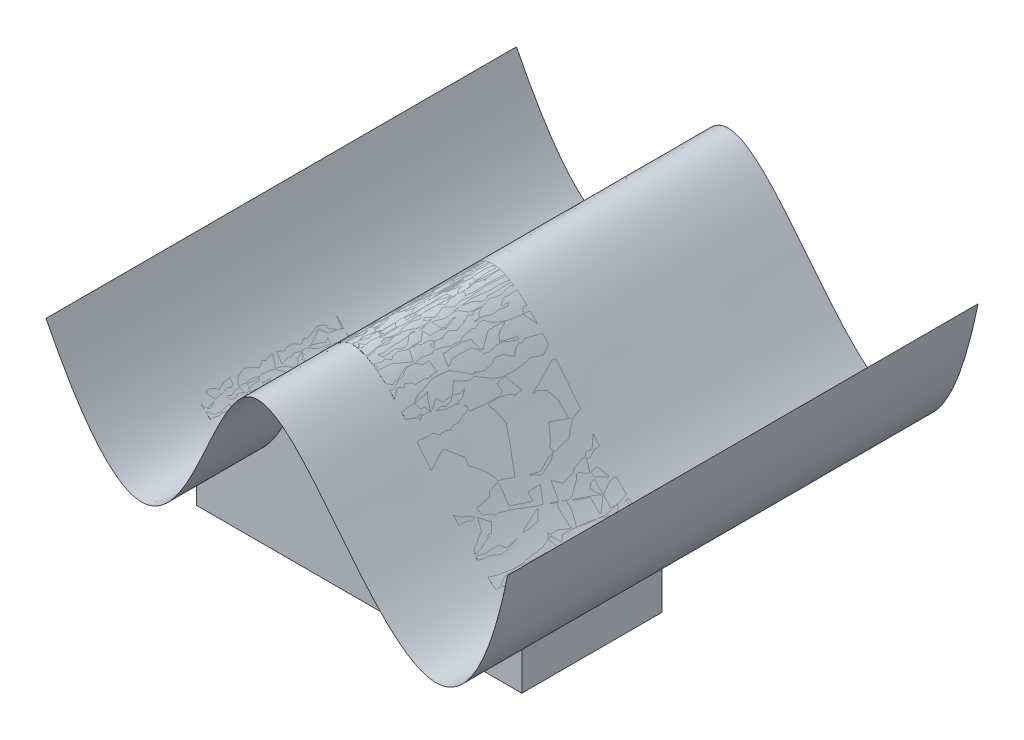
ISO-10303-21;
HEADER;
FILE_DESCRIPTION(('STEP AP214'),'2;1');
FILE_NAME('part.step','',(''),(''),'','','');
FILE_SCHEMA(('AUTOMOTIVE_DESIGN { 1 0 10303 214 1 1 1 1 }'));
ENDSEC;
DATA;
#1=APPLICATION_CONTEXT('core data for automotive mechanical design processes');
#2=APPLICATION_PROTOCOL_DEFINITION('international standard','automotive_design',2000,#1);
#3=PRODUCT_CONTEXT('',#1,'mechanical');
#4=PRODUCT('Part','Part','',(#3));
#5=PRODUCT_RELATED_PRODUCT_CATEGORY('part','',(#4));
#6=PRODUCT_DEFINITION_FORMATION('','',#4);
#7=PRODUCT_DEFINITION_CONTEXT('part definition',#1,'design');
#8=PRODUCT_DEFINITION('design','',#6,#7);
#9=PRODUCT_DEFINITION_SHAPE('','',#8);
#10=(LENGTH_UNIT() NAMED_UNIT(*) SI_UNIT(.MILLI.,.METRE.));
#11=(NAMED_UNIT(*) PLANE_ANGLE_UNIT() SI_UNIT($,.RADIAN.));
#12=(NAMED_UNIT(*) SI_UNIT($,.STERADIAN.) SOLID_ANGLE_UNIT());
#13=UNCERTAINTY_MEASURE_WITH_UNIT(LENGTH_MEASURE(1.E-05),#10,'distance_accuracy_value','');
#14=(GEOMETRIC_REPRESENTATION_CONTEXT(3) GLOBAL_UNCERTAINTY_ASSIGNED_CONTEXT((#13)) GLOBAL_UNIT_ASSIGNED_CONTEXT((#10,
#11,#12)) REPRESENTATION_CONTEXT('',''));
#15=CARTESIAN_POINT('',(0.,0.,0.));
#16=DIRECTION('',(0.,0.,1.));
#17=DIRECTION('',(1.,0.,0.));
#18=AXIS2_PLACEMENT_3D('',#15,#16,#17);
#19=CARTESIAN_POINT('',(-77.832747832669,15.5532561851788,-84.));
#20=CARTESIAN_POINT('',(-31.2957727130058,-76.7212333417488,-84.));
#21=CARTESIAN_POINT('',(-15.7872694517229,142.067524092007,-84.));
#22=CARTESIAN_POINT('',(64.2620915758553,-94.6050512746465,-84.));
#23=CARTESIAN_POINT('',(87.0051809675181,18.4778000832466,-84.));
#24=B_SPLINE_CURVE_WITH_KNOTS('',3,(#19,#20,#21,#22,#23),.UNSPECIFIED.,.F.,.F.,(4,1,4),(0.,
0.440401052150219,1.),.UNSPECIFIED.);
#25=DIRECTION('',(0.,0.,1.));
#26=VECTOR('',#25,1.);
#27=SURFACE_OF_LINEAR_EXTRUSION('',#24,#26);
#28=CARTESIAN_POINT('',(-77.832747832669,15.5532561851788,84.));
#29=CARTESIAN_POINT('',(-31.2957727130058,-76.7212333417488,84.));
#30=CARTESIAN_POINT('',(-15.7872694517229,142.067524092007,84.));
#31=CARTESIAN_POINT('',(64.2620915758553,-94.6050512746465,84.));
#32=CARTESIAN_POINT('',(87.0051809675181,18.4778000832466,84.));
#33=B_SPLINE_CURVE_WITH_KNOTS('',3,(#28,#29,#30,#31,#32),.UNSPECIFIED.,.F.,.F.,(4,1,4),(0.,
0.440401052150219,1.),.UNSPECIFIED.);
#34=CARTESIAN_POINT('',(-77.832747832669,15.5532561851788,84.));
#35=VERTEX_POINT('',#34);
#36=CARTESIAN_POINT('',(87.0051809675181,18.4778000832466,84.));
#37=VERTEX_POINT('',#36);
#38=EDGE_CURVE('E70',#35,#37,#33,.T.);
#39=ORIENTED_EDGE('',*,*,#38,.F.);
#40=DIRECTION('',(0.,0.,1.));
#41=VECTOR('',#40,1.);
#42=CARTESIAN_POINT('',(-77.832747832669,15.5532561851788,-84.));
#43=LINE('',#42,#41);
#44=CARTESIAN_POINT('',(-77.832747832669,15.5532561851788,-84.));
#45=VERTEX_POINT('',#44);
#46=EDGE_CURVE('E52',#45,#35,#43,.T.);
#47=ORIENTED_EDGE('',*,*,#46,.F.);
#48=CARTESIAN_POINT('',(87.0051809675181,18.4778000832466,-84.));
#49=VERTEX_POINT('',#48);
#50=EDGE_CURVE('E58',#45,#49,#24,.T.);
#51=ORIENTED_EDGE('',*,*,#50,.T.);
#52=DIRECTION('',(0.,0.,1.));
#53=VECTOR('',#52,1.);
#54=CARTESIAN_POINT('',(87.0051809675181,18.4778000832466,-84.));
#55=LINE('',#54,#53);
#56=EDGE_CURVE('E12',#49,#37,#55,.T.);
#57=ORIENTED_EDGE('',*,*,#56,.T.);
#58=EDGE_LOOP('',(#39,#47,#51,#57));
#59=FACE_BOUND('',#58,.T.);
#60=ADVANCED_FACE('F50',(#59),#27,.T.);
#61=OPEN_SHELL('',(#60));
#62=SHELL_BASED_SURFACE_MODEL('B2',(#61));
#63=CARTESIAN_POINT('',(58.1025942557948,-49.406172689789,50.));
#64=DIRECTION('',(-1.,0.,0.));
#65=DIRECTION('',(0.,0.,1.));
#66=AXIS2_PLACEMENT_3D('',#63,#64,#65);
#67=PLANE('',#66);
#68=DIRECTION('',(0.,1.,0.));
#69=VECTOR('',#68,1.);
#70=CARTESIAN_POINT('',(58.1025942557948,-49.406172689789,0.));
#71=LINE('',#70,#69);
#72=CARTESIAN_POINT('',(58.1025942557948,-49.406172689789,0.));
#73=VERTEX_POINT('',#72);
#74=CARTESIAN_POINT('',(58.1025942557948,-27.0492809328574,0.));
#75=VERTEX_POINT('',#74);
#76=EDGE_CURVE('E155',#73,#75,#71,.T.);
#77=ORIENTED_EDGE('',*,*,#76,.T.);
#78=DIRECTION('',(0.,0.,1.));
#79=VECTOR('',#78,1.);
#80=CARTESIAN_POINT('',(58.1025942557949,-27.0492809328573,-84.));
#81=LINE('',#80,#79);
#82=CARTESIAN_POINT('',(58.1025942557948,-27.0492809328574,50.));
#83=VERTEX_POINT('',#82);
#84=EDGE_CURVE('E128',#75,#83,#81,.T.);
#85=ORIENTED_EDGE('',*,*,#84,.T.);
#86=DIRECTION('',(0.,1.,0.));
#87=VECTOR('',#86,1.);
#88=CARTESIAN_POINT('',(58.1025942557948,-49.406172689789,50.));
#89=LINE('',#88,#87);
#90=CARTESIAN_POINT('',(58.1025942557948,-49.406172689789,50.));
#91=VERTEX_POINT('',#90);
#92=EDGE_CURVE('E170',#91,#83,#89,.T.);
#93=ORIENTED_EDGE('',*,*,#92,.F.);
#94=DIRECTION('',(0.,0.,-1.));
#95=VECTOR('',#94,1.);
#96=CARTESIAN_POINT('',(58.1025942557948,-49.406172689789,50.));
#97=LINE('',#96,#95);
#98=EDGE_CURVE('E178',#91,#73,#97,.T.);
#99=ORIENTED_EDGE('',*,*,#98,.T.);
#100=EDGE_LOOP('',(#77,#85,#93,#99));
#101=FACE_BOUND('',#100,.T.);
#102=ADVANCED_FACE('F104',(#101),#67,.F.);
#103=CARTESIAN_POINT('',(-58.1025942557948,-49.406172689789,50.));
#104=DIRECTION('',(1.,0.,0.));
#105=DIRECTION('',(0.,0.,-1.));
#106=AXIS2_PLACEMENT_3D('',#103,#104,#105);
#107=PLANE('',#106);
#108=DIRECTION('',(0.,-1.,0.));
#109=VECTOR('',#108,1.);
#110=CARTESIAN_POINT('',(-58.1025942557948,-49.406172689789,50.));
#111=LINE('',#110,#109);
#112=CARTESIAN_POINT('',(-58.1025942557948,-15.6375478713996,50.));
#113=VERTEX_POINT('',#112);
#114=CARTESIAN_POINT('',(-58.1025942557948,-49.406172689789,50.));
#115=VERTEX_POINT('',#114);
#116=EDGE_CURVE('E160',#113,#115,#111,.T.);
#117=ORIENTED_EDGE('',*,*,#116,.F.);
#118=DIRECTION('',(0.,0.,1.));
#119=VECTOR('',#118,1.);
#120=CARTESIAN_POINT('',(-58.1025942557948,-15.6375478820782,-84.));
#121=LINE('',#120,#119);
#122=CARTESIAN_POINT('',(-58.1025942655421,-15.6375478713995,0.));
#123=VERTEX_POINT('',#122);
#124=EDGE_CURVE('E158',#113,#123,#121,.F.);
#125=ORIENTED_EDGE('',*,*,#124,.T.);
#126=DIRECTION('',(0.,-1.,0.));
#127=VECTOR('',#126,1.);
#128=CARTESIAN_POINT('',(-58.1025942557948,-49.406172689789,0.));
#129=LINE('',#128,#127);
#130=CARTESIAN_POINT('',(-58.1025942557948,-49.406172689789,0.));
#131=VERTEX_POINT('',#130);
#132=EDGE_CURVE('E147',#123,#131,#129,.T.);
#133=ORIENTED_EDGE('',*,*,#132,.T.);
#134=DIRECTION('',(0.,0.,-1.));
#135=VECTOR('',#134,1.);
#136=CARTESIAN_POINT('',(-58.1025942557948,-49.406172689789,50.));
#137=LINE('',#136,#135);
#138=EDGE_CURVE('E113',#115,#131,#137,.T.);
#139=ORIENTED_EDGE('',*,*,#138,.F.);
#140=EDGE_LOOP('',(#117,#125,#133,#139));
#141=FACE_BOUND('',#140,.T.);
#142=ADVANCED_FACE('F159',(#141),#107,.F.);
#143=CARTESIAN_POINT('',(-58.1025942557948,-49.406172689789,50.));
#144=DIRECTION('',(0.,1.,0.));
#145=DIRECTION('',(0.,0.,1.));
#146=AXIS2_PLACEMENT_3D('',#143,#144,#145);
#147=PLANE('',#146);
#148=DIRECTION('',(1.,0.,0.));
#149=VECTOR('',#148,1.);
#150=CARTESIAN_POINT('',(-58.1025942557948,-49.406172689789,0.));
#151=LINE('',#150,#149);
#152=EDGE_CURVE('E151',#131,#73,#151,.T.);
#153=ORIENTED_EDGE('',*,*,#152,.T.);
#154=ORIENTED_EDGE('',*,*,#98,.F.);
#155=DIRECTION('',(1.,0.,0.));
#156=VECTOR('',#155,1.);
#157=CARTESIAN_POINT('',(-58.1025942557948,-49.406172689789,50.));
#158=LINE('',#157,#156);
#159=EDGE_CURVE('E176',#115,#91,#158,.T.);
#160=ORIENTED_EDGE('',*,*,#159,.F.);
#161=ORIENTED_EDGE('',*,*,#138,.T.);
#162=EDGE_LOOP('',(#153,#154,#160,#161));
#163=FACE_BOUND('',#162,.T.);
#164=ADVANCED_FACE('F184',(#163),#147,.F.);
#165=CARTESIAN_POINT('',(0.,0.,50.));
#166=DIRECTION('',(0.,0.,-1.));
#167=DIRECTION('',(-1.,0.,0.));
#168=AXIS2_PLACEMENT_3D('',#165,#166,#167);
#169=PLANE('',#168);
#170=ORIENTED_EDGE('',*,*,#92,.T.);
#171=CARTESIAN_POINT('',(-77.832747832669,15.5532561851788,50.));
#172=CARTESIAN_POINT('',(-31.2957727130058,-76.7212333417488,50.));
#173=CARTESIAN_POINT('',(-15.7872694517229,142.067524092007,50.));
#174=CARTESIAN_POINT('',(64.2620915758553,-94.6050512746465,50.));
#175=CARTESIAN_POINT('',(87.0051809675181,18.4778000832466,50.));
#176=B_SPLINE_CURVE_WITH_KNOTS('',3,(#171,#172,#173,#174,#175),.UNSPECIFIED.,.F.,.F.,(4,1,4),
(0.,0.440401052150219,1.),.UNSPECIFIED.);
#177=EDGE_CURVE('E120',#83,#113,#176,.F.);
#178=ORIENTED_EDGE('',*,*,#177,.T.);
#179=ORIENTED_EDGE('',*,*,#116,.T.);
#180=ORIENTED_EDGE('',*,*,#159,.T.);
#181=EDGE_LOOP('',(#170,#178,#179,#180));
#182=FACE_BOUND('',#181,.T.);
#183=ADVANCED_FACE('F186',(#182),#169,.F.);
#184=CARTESIAN_POINT('',(0.,0.,0.));
#185=DIRECTION('',(0.,0.,-1.));
#186=DIRECTION('',(-1.,0.,0.));
#187=AXIS2_PLACEMENT_3D('',#184,#185,#186);
#188=PLANE('',#187);
#189=CARTESIAN_POINT('',(-77.832747832669,15.5532561851788,0.));
#190=CARTESIAN_POINT('',(-31.2957727130058,-76.7212333417488,0.));
#191=CARTESIAN_POINT('',(-15.7872694517229,142.067524092007,0.));
#192=CARTESIAN_POINT('',(64.2620915758553,-94.6050512746465,0.));
#193=CARTESIAN_POINT('',(87.0051809675181,18.4778000832466,0.));
#194=B_SPLINE_CURVE_WITH_KNOTS('',3,(#189,#190,#191,#192,#193),.UNSPECIFIED.,.F.,.F.,(4,1,4),
(0.,0.440401052150219,1.),.UNSPECIFIED.);
#195=EDGE_CURVE('E48',#75,#123,#194,.F.);
#196=ORIENTED_EDGE('',*,*,#195,.F.);
#197=ORIENTED_EDGE('',*,*,#76,.F.);
#198=ORIENTED_EDGE('',*,*,#152,.F.);
#199=ORIENTED_EDGE('',*,*,#132,.F.);
#200=EDGE_LOOP('',(#196,#197,#198,#199));
#201=FACE_BOUND('',#200,.T.);
#202=ADVANCED_FACE('F149',(#201),#188,.T.);
#203=CARTESIAN_POINT('',(-77.832747832669,15.5532561851788,-84.));
#204=CARTESIAN_POINT('',(-31.2957727130058,-76.7212333417488,-84.));
#205=CARTESIAN_POINT('',(-15.7872694517229,142.067524092007,-84.));
#206=CARTESIAN_POINT('',(64.2620915758553,-94.6050512746465,-84.));
#207=CARTESIAN_POINT('',(87.0051809675181,18.4778000832466,-84.));
#208=B_SPLINE_CURVE_WITH_KNOTS('',3,(#203,#204,#205,#206,#207),.UNSPECIFIED.,.F.,.F.,(4,1,4),
(0.,0.440401052150219,1.),.UNSPECIFIED.);
#209=DIRECTION('',(0.,0.,1.));
#210=VECTOR('',#209,1.);
#211=SURFACE_OF_LINEAR_EXTRUSION('',#208,#210);
#212=ORIENTED_EDGE('',*,*,#177,.F.);
#213=ORIENTED_EDGE('',*,*,#84,.F.);
#214=ORIENTED_EDGE('',*,*,#195,.T.);
#215=ORIENTED_EDGE('',*,*,#124,.F.);
#216=EDGE_LOOP('',(#212,#213,#214,#215));
#217=FACE_BOUND('',#216,.T.);
#218=ADVANCED_FACE('F163',(#217),#211,.F.);
#219=CLOSED_SHELL('',(#102,#142,#164,#183,#202,#218));
#220=MANIFOLD_SOLID_BREP('B6',#219);
#221=ADVANCED_BREP_SHAPE_REPRESENTATION('',(#18,#220),#14);
#222=MANIFOLD_SURFACE_SHAPE_REPRESENTATION('',(#18,#62),#14);
#223=SHAPE_REPRESENTATION('',(#18),#14);
#224=SHAPE_DEFINITION_REPRESENTATION(#9,#223);
#225=SHAPE_REPRESENTATION_RELATIONSHIP('','',#223,#221);
#226=SHAPE_REPRESENTATION_RELATIONSHIP('','',#223,#222);
ENDSEC;
END-ISO-10303-21;
